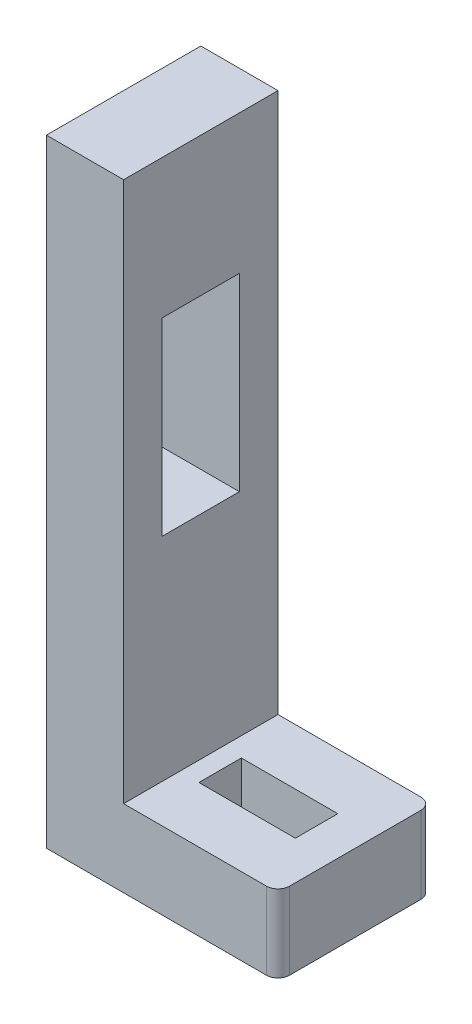
ISO-10303-21;
HEADER;
FILE_DESCRIPTION(('STEP AP214'),'2;1');
FILE_NAME('part.step','',(''),(''),'','','');
FILE_SCHEMA(('AUTOMOTIVE_DESIGN { 1 0 10303 214 1 1 1 1 }'));
ENDSEC;
DATA;
#1=APPLICATION_CONTEXT('core data for automotive mechanical design processes');
#2=APPLICATION_PROTOCOL_DEFINITION('international standard','automotive_design',2000,#1);
#3=PRODUCT_CONTEXT('',#1,'mechanical');
#4=PRODUCT('Part','Part','',(#3));
#5=PRODUCT_RELATED_PRODUCT_CATEGORY('part','',(#4));
#6=PRODUCT_DEFINITION_FORMATION('','',#4);
#7=PRODUCT_DEFINITION_CONTEXT('part definition',#1,'design');
#8=PRODUCT_DEFINITION('design','',#6,#7);
#9=PRODUCT_DEFINITION_SHAPE('','',#8);
#10=(LENGTH_UNIT() NAMED_UNIT(*) SI_UNIT(.MILLI.,.METRE.));
#11=(NAMED_UNIT(*) PLANE_ANGLE_UNIT() SI_UNIT($,.RADIAN.));
#12=(NAMED_UNIT(*) SI_UNIT($,.STERADIAN.) SOLID_ANGLE_UNIT());
#13=UNCERTAINTY_MEASURE_WITH_UNIT(LENGTH_MEASURE(1.E-05),#10,'distance_accuracy_value','');
#14=(GEOMETRIC_REPRESENTATION_CONTEXT(3) GLOBAL_UNCERTAINTY_ASSIGNED_CONTEXT((#13)) GLOBAL_UNIT_ASSIGNED_CONTEXT((#10,
#11,#12)) REPRESENTATION_CONTEXT('',''));
#15=CARTESIAN_POINT('',(0.,0.,0.));
#16=DIRECTION('',(0.,0.,1.));
#17=DIRECTION('',(1.,0.,0.));
#18=AXIS2_PLACEMENT_3D('',#15,#16,#17);
#19=CARTESIAN_POINT('',(60.,0.,40.));
#20=DIRECTION('',(0.,1.,0.));
#21=DIRECTION('',(-1.,0.,0.));
#22=AXIS2_PLACEMENT_3D('',#19,#20,#21);
#23=PLANE('',#22);
#24=DIRECTION('',(-1.,0.,0.));
#25=VECTOR('',#24,1.);
#26=CARTESIAN_POINT('',(25.,0.,14.5));
#27=LINE('',#26,#25);
#28=CARTESIAN_POINT('',(50.,0.,14.5));
#29=VERTEX_POINT('',#28);
#30=CARTESIAN_POINT('',(25.,0.,14.5));
#31=VERTEX_POINT('',#30);
#32=EDGE_CURVE('E193',#29,#31,#27,.T.);
#33=ORIENTED_EDGE('',*,*,#32,.T.);
#34=DIRECTION('',(0.,0.,1.));
#35=VECTOR('',#34,1.);
#36=CARTESIAN_POINT('',(25.,0.,14.5));
#37=LINE('',#36,#35);
#38=CARTESIAN_POINT('',(25.,0.,25.5));
#39=VERTEX_POINT('',#38);
#40=EDGE_CURVE('E183',#31,#39,#37,.T.);
#41=ORIENTED_EDGE('',*,*,#40,.T.);
#42=DIRECTION('',(1.,0.,0.));
#43=VECTOR('',#42,1.);
#44=CARTESIAN_POINT('',(25.,0.,25.5));
#45=LINE('',#44,#43);
#46=CARTESIAN_POINT('',(50.,0.,25.5));
#47=VERTEX_POINT('',#46);
#48=EDGE_CURVE('E186',#39,#47,#45,.T.);
#49=ORIENTED_EDGE('',*,*,#48,.T.);
#50=DIRECTION('',(0.,0.,-1.));
#51=VECTOR('',#50,1.);
#52=CARTESIAN_POINT('',(50.,0.,14.5));
#53=LINE('',#52,#51);
#54=EDGE_CURVE('E190',#47,#29,#53,.T.);
#55=ORIENTED_EDGE('',*,*,#54,.T.);
#56=EDGE_LOOP('',(#33,#41,#49,#55));
#57=FACE_BOUND('',#56,.T.);
#58=DIRECTION('',(1.,0.,0.));
#59=VECTOR('',#58,1.);
#60=CARTESIAN_POINT('',(60.,0.,0.));
#61=LINE('',#60,#59);
#62=CARTESIAN_POINT('',(0.,0.,0.));
#63=VERTEX_POINT('',#62);
#64=CARTESIAN_POINT('',(57.,0.,0.));
#65=VERTEX_POINT('',#64);
#66=EDGE_CURVE('E208',#63,#65,#61,.T.);
#67=ORIENTED_EDGE('',*,*,#66,.T.);
#68=CARTESIAN_POINT('',(57.,0.,3.));
#69=DIRECTION('',(0.,1.,0.));
#70=DIRECTION('',(-1.,0.,0.));
#71=AXIS2_PLACEMENT_3D('',#68,#69,#70);
#72=CIRCLE('',#71,3.);
#73=CARTESIAN_POINT('',(60.,0.,3.));
#74=VERTEX_POINT('',#73);
#75=EDGE_CURVE('E41',#65,#74,#72,.F.);
#76=ORIENTED_EDGE('',*,*,#75,.T.);
#77=DIRECTION('',(0.,0.,-1.));
#78=VECTOR('',#77,1.);
#79=CARTESIAN_POINT('',(60.,0.,40.));
#80=LINE('',#79,#78);
#81=CARTESIAN_POINT('',(60.,0.,37.));
#82=VERTEX_POINT('',#81);
#83=EDGE_CURVE('E251',#82,#74,#80,.T.);
#84=ORIENTED_EDGE('',*,*,#83,.F.);
#85=CARTESIAN_POINT('',(57.,0.,37.));
#86=DIRECTION('',(0.,1.,0.));
#87=DIRECTION('',(-1.,0.,0.));
#88=AXIS2_PLACEMENT_3D('',#85,#86,#87);
#89=CIRCLE('',#88,3.);
#90=CARTESIAN_POINT('',(57.,0.,40.));
#91=VERTEX_POINT('',#90);
#92=EDGE_CURVE('E265',#82,#91,#89,.F.);
#93=ORIENTED_EDGE('',*,*,#92,.T.);
#94=DIRECTION('',(1.,0.,0.));
#95=VECTOR('',#94,1.);
#96=CARTESIAN_POINT('',(60.,0.,40.));
#97=LINE('',#96,#95);
#98=CARTESIAN_POINT('',(0.,0.,40.));
#99=VERTEX_POINT('',#98);
#100=EDGE_CURVE('E215',#99,#91,#97,.T.);
#101=ORIENTED_EDGE('',*,*,#100,.F.);
#102=DIRECTION('',(0.,0.,-1.));
#103=VECTOR('',#102,1.);
#104=CARTESIAN_POINT('',(0.,0.,40.));
#105=LINE('',#104,#103);
#106=EDGE_CURVE('E227',#99,#63,#105,.T.);
#107=ORIENTED_EDGE('',*,*,#106,.T.);
#108=EDGE_LOOP('',(#67,#76,#84,#93,#101,#107));
#109=FACE_BOUND('',#108,.T.);
#110=ADVANCED_FACE('F33',(#57,#109),#23,.F.);
#111=CARTESIAN_POINT('',(60.,20.,40.));
#112=DIRECTION('',(-1.,0.,0.));
#113=DIRECTION('',(0.,0.,1.));
#114=AXIS2_PLACEMENT_3D('',#111,#112,#113);
#115=PLANE('',#114);
#116=ORIENTED_EDGE('',*,*,#83,.T.);
#117=DIRECTION('',(0.,1.,0.));
#118=VECTOR('',#117,1.);
#119=CARTESIAN_POINT('',(60.,20.,3.));
#120=LINE('',#119,#118);
#121=CARTESIAN_POINT('',(60.,20.,3.));
#122=VERTEX_POINT('',#121);
#123=EDGE_CURVE('E256',#74,#122,#120,.T.);
#124=ORIENTED_EDGE('',*,*,#123,.T.);
#125=DIRECTION('',(0.,0.,-1.));
#126=VECTOR('',#125,1.);
#127=CARTESIAN_POINT('',(60.,20.,40.));
#128=LINE('',#127,#126);
#129=CARTESIAN_POINT('',(60.,20.,37.));
#130=VERTEX_POINT('',#129);
#131=EDGE_CURVE('E248',#130,#122,#128,.T.);
#132=ORIENTED_EDGE('',*,*,#131,.F.);
#133=DIRECTION('',(0.,1.,0.));
#134=VECTOR('',#133,1.);
#135=CARTESIAN_POINT('',(60.,20.,37.));
#136=LINE('',#135,#134);
#137=EDGE_CURVE('E254',#130,#82,#136,.F.);
#138=ORIENTED_EDGE('',*,*,#137,.T.);
#139=EDGE_LOOP('',(#116,#124,#132,#138));
#140=FACE_BOUND('',#139,.T.);
#141=ADVANCED_FACE('F275',(#140),#115,.F.);
#142=CARTESIAN_POINT('',(20.,20.,40.));
#143=DIRECTION('',(0.,-1.,0.));
#144=DIRECTION('',(0.,0.,-1.));
#145=AXIS2_PLACEMENT_3D('',#142,#143,#144);
#146=PLANE('',#145);
#147=DIRECTION('',(1.,0.,0.));
#148=VECTOR('',#147,1.);
#149=CARTESIAN_POINT('',(25.,20.,25.5));
#150=LINE('',#149,#148);
#151=CARTESIAN_POINT('',(25.,20.,25.5));
#152=VERTEX_POINT('',#151);
#153=CARTESIAN_POINT('',(50.,20.,25.5));
#154=VERTEX_POINT('',#153);
#155=EDGE_CURVE('E198',#152,#154,#150,.T.);
#156=ORIENTED_EDGE('',*,*,#155,.F.);
#157=DIRECTION('',(0.,0.,1.));
#158=VECTOR('',#157,1.);
#159=CARTESIAN_POINT('',(25.,20.,14.5));
#160=LINE('',#159,#158);
#161=CARTESIAN_POINT('',(25.,20.,14.5));
#162=VERTEX_POINT('',#161);
#163=EDGE_CURVE('E179',#162,#152,#160,.T.);
#164=ORIENTED_EDGE('',*,*,#163,.F.);
#165=DIRECTION('',(-1.,0.,0.));
#166=VECTOR('',#165,1.);
#167=CARTESIAN_POINT('',(25.,20.,14.5));
#168=LINE('',#167,#166);
#169=CARTESIAN_POINT('',(50.,20.,14.5));
#170=VERTEX_POINT('',#169);
#171=EDGE_CURVE('E187',#170,#162,#168,.T.);
#172=ORIENTED_EDGE('',*,*,#171,.F.);
#173=DIRECTION('',(0.,0.,-1.));
#174=VECTOR('',#173,1.);
#175=CARTESIAN_POINT('',(50.,20.,14.5));
#176=LINE('',#175,#174);
#177=EDGE_CURVE('E201',#154,#170,#176,.T.);
#178=ORIENTED_EDGE('',*,*,#177,.F.);
#179=EDGE_LOOP('',(#156,#164,#172,#178));
#180=FACE_BOUND('',#179,.T.);
#181=ORIENTED_EDGE('',*,*,#131,.T.);
#182=CARTESIAN_POINT('',(57.,20.,3.));
#183=DIRECTION('',(0.,-1.,0.));
#184=DIRECTION('',(0.,0.,-1.));
#185=AXIS2_PLACEMENT_3D('',#182,#183,#184);
#186=CIRCLE('',#185,3.);
#187=CARTESIAN_POINT('',(57.,20.,0.));
#188=VERTEX_POINT('',#187);
#189=EDGE_CURVE('E261',#122,#188,#186,.F.);
#190=ORIENTED_EDGE('',*,*,#189,.T.);
#191=DIRECTION('',(-1.,0.,0.));
#192=VECTOR('',#191,1.);
#193=CARTESIAN_POINT('',(20.,20.,0.));
#194=LINE('',#193,#192);
#195=CARTESIAN_POINT('',(20.,20.,0.));
#196=VERTEX_POINT('',#195);
#197=EDGE_CURVE('E230',#188,#196,#194,.T.);
#198=ORIENTED_EDGE('',*,*,#197,.T.);
#199=DIRECTION('',(0.,0.,-1.));
#200=VECTOR('',#199,1.);
#201=CARTESIAN_POINT('',(20.,20.,40.));
#202=LINE('',#201,#200);
#203=CARTESIAN_POINT('',(20.,20.,40.));
#204=VERTEX_POINT('',#203);
#205=EDGE_CURVE('E245',#204,#196,#202,.T.);
#206=ORIENTED_EDGE('',*,*,#205,.F.);
#207=DIRECTION('',(-1.,0.,0.));
#208=VECTOR('',#207,1.);
#209=CARTESIAN_POINT('',(20.,20.,40.));
#210=LINE('',#209,#208);
#211=CARTESIAN_POINT('',(57.,20.,40.));
#212=VERTEX_POINT('',#211);
#213=EDGE_CURVE('E218',#212,#204,#210,.T.);
#214=ORIENTED_EDGE('',*,*,#213,.F.);
#215=CARTESIAN_POINT('',(57.,20.,37.));
#216=DIRECTION('',(0.,-1.,0.));
#217=DIRECTION('',(0.,0.,-1.));
#218=AXIS2_PLACEMENT_3D('',#215,#216,#217);
#219=CIRCLE('',#218,3.);
#220=EDGE_CURVE('E259',#212,#130,#219,.F.);
#221=ORIENTED_EDGE('',*,*,#220,.T.);
#222=EDGE_LOOP('',(#181,#190,#198,#206,#214,#221));
#223=FACE_BOUND('',#222,.T.);
#224=ADVANCED_FACE('F281',(#180,#223),#146,.F.);
#225=CARTESIAN_POINT('',(20.,160.,40.));
#226=DIRECTION('',(-1.,0.,0.));
#227=DIRECTION('',(0.,-1.,0.));
#228=AXIS2_PLACEMENT_3D('',#225,#226,#227);
#229=PLANE('',#228);
#230=DIRECTION('',(0.,0.,-1.));
#231=VECTOR('',#230,1.);
#232=CARTESIAN_POINT('',(20.,75.,30.));
#233=LINE('',#232,#231);
#234=CARTESIAN_POINT('',(20.,75.,30.));
#235=VERTEX_POINT('',#234);
#236=CARTESIAN_POINT('',(20.,75.,10.));
#237=VERTEX_POINT('',#236);
#238=EDGE_CURVE('E173',#235,#237,#233,.T.);
#239=ORIENTED_EDGE('',*,*,#238,.F.);
#240=DIRECTION('',(0.,-1.,0.));
#241=VECTOR('',#240,1.);
#242=CARTESIAN_POINT('',(20.,124.,30.));
#243=LINE('',#242,#241);
#244=CARTESIAN_POINT('',(20.,124.,30.));
#245=VERTEX_POINT('',#244);
#246=EDGE_CURVE('E48',#245,#235,#243,.T.);
#247=ORIENTED_EDGE('',*,*,#246,.F.);
#248=DIRECTION('',(0.,0.,1.));
#249=VECTOR('',#248,1.);
#250=CARTESIAN_POINT('',(20.,124.,30.));
#251=LINE('',#250,#249);
#252=CARTESIAN_POINT('',(20.,124.,10.));
#253=VERTEX_POINT('',#252);
#254=EDGE_CURVE('E164',#253,#245,#251,.T.);
#255=ORIENTED_EDGE('',*,*,#254,.F.);
#256=DIRECTION('',(0.,1.,0.));
#257=VECTOR('',#256,1.);
#258=CARTESIAN_POINT('',(20.,124.,10.));
#259=LINE('',#258,#257);
#260=EDGE_CURVE('E167',#237,#253,#259,.T.);
#261=ORIENTED_EDGE('',*,*,#260,.F.);
#262=EDGE_LOOP('',(#239,#247,#255,#261));
#263=FACE_BOUND('',#262,.T.);
#264=DIRECTION('',(0.,1.,0.));
#265=VECTOR('',#264,1.);
#266=CARTESIAN_POINT('',(20.,160.,0.));
#267=LINE('',#266,#265);
#268=CARTESIAN_POINT('',(20.,160.,0.));
#269=VERTEX_POINT('',#268);
#270=EDGE_CURVE('E232',#196,#269,#267,.T.);
#271=ORIENTED_EDGE('',*,*,#270,.T.);
#272=DIRECTION('',(0.,0.,-1.));
#273=VECTOR('',#272,1.);
#274=CARTESIAN_POINT('',(20.,160.,40.));
#275=LINE('',#274,#273);
#276=CARTESIAN_POINT('',(20.,160.,40.));
#277=VERTEX_POINT('',#276);
#278=EDGE_CURVE('E242',#277,#269,#275,.T.);
#279=ORIENTED_EDGE('',*,*,#278,.F.);
#280=DIRECTION('',(0.,1.,0.));
#281=VECTOR('',#280,1.);
#282=CARTESIAN_POINT('',(20.,160.,40.));
#283=LINE('',#282,#281);
#284=EDGE_CURVE('E221',#204,#277,#283,.T.);
#285=ORIENTED_EDGE('',*,*,#284,.F.);
#286=ORIENTED_EDGE('',*,*,#205,.T.);
#287=EDGE_LOOP('',(#271,#279,#285,#286));
#288=FACE_BOUND('',#287,.T.);
#289=ADVANCED_FACE('F290',(#263,#288),#229,.F.);
#290=CARTESIAN_POINT('',(0.,160.,40.));
#291=DIRECTION('',(0.,-1.,0.));
#292=DIRECTION('',(0.,0.,-1.));
#293=AXIS2_PLACEMENT_3D('',#290,#291,#292);
#294=PLANE('',#293);
#295=DIRECTION('',(-1.,0.,0.));
#296=VECTOR('',#295,1.);
#297=CARTESIAN_POINT('',(0.,160.,0.));
#298=LINE('',#297,#296);
#299=CARTESIAN_POINT('',(0.,160.,0.));
#300=VERTEX_POINT('',#299);
#301=EDGE_CURVE('E234',#269,#300,#298,.T.);
#302=ORIENTED_EDGE('',*,*,#301,.T.);
#303=DIRECTION('',(0.,0.,-1.));
#304=VECTOR('',#303,1.);
#305=CARTESIAN_POINT('',(0.,160.,40.));
#306=LINE('',#305,#304);
#307=CARTESIAN_POINT('',(0.,160.,40.));
#308=VERTEX_POINT('',#307);
#309=EDGE_CURVE('E239',#308,#300,#306,.T.);
#310=ORIENTED_EDGE('',*,*,#309,.F.);
#311=DIRECTION('',(-1.,0.,0.));
#312=VECTOR('',#311,1.);
#313=CARTESIAN_POINT('',(0.,160.,40.));
#314=LINE('',#313,#312);
#315=EDGE_CURVE('E223',#277,#308,#314,.T.);
#316=ORIENTED_EDGE('',*,*,#315,.F.);
#317=ORIENTED_EDGE('',*,*,#278,.T.);
#318=EDGE_LOOP('',(#302,#310,#316,#317));
#319=FACE_BOUND('',#318,.T.);
#320=ADVANCED_FACE('F294',(#319),#294,.F.);
#321=CARTESIAN_POINT('',(0.,0.,40.));
#322=DIRECTION('',(1.,0.,0.));
#323=DIRECTION('',(0.,0.,-1.));
#324=AXIS2_PLACEMENT_3D('',#321,#322,#323);
#325=PLANE('',#324);
#326=DIRECTION('',(0.,0.,1.));
#327=VECTOR('',#326,1.);
#328=CARTESIAN_POINT('',(0.,124.,30.));
#329=LINE('',#328,#327);
#330=CARTESIAN_POINT('',(0.,124.,10.));
#331=VERTEX_POINT('',#330);
#332=CARTESIAN_POINT('',(0.,124.,30.));
#333=VERTEX_POINT('',#332);
#334=EDGE_CURVE('E154',#331,#333,#329,.T.);
#335=ORIENTED_EDGE('',*,*,#334,.T.);
#336=DIRECTION('',(0.,-1.,0.));
#337=VECTOR('',#336,1.);
#338=CARTESIAN_POINT('',(0.,124.,30.));
#339=LINE('',#338,#337);
#340=CARTESIAN_POINT('',(0.,75.,30.));
#341=VERTEX_POINT('',#340);
#342=EDGE_CURVE('E148',#333,#341,#339,.T.);
#343=ORIENTED_EDGE('',*,*,#342,.T.);
#344=DIRECTION('',(0.,0.,-1.));
#345=VECTOR('',#344,1.);
#346=CARTESIAN_POINT('',(0.,75.,30.));
#347=LINE('',#346,#345);
#348=CARTESIAN_POINT('',(0.,75.,10.));
#349=VERTEX_POINT('',#348);
#350=EDGE_CURVE('E157',#341,#349,#347,.T.);
#351=ORIENTED_EDGE('',*,*,#350,.T.);
#352=DIRECTION('',(0.,1.,0.));
#353=VECTOR('',#352,1.);
#354=CARTESIAN_POINT('',(0.,124.,10.));
#355=LINE('',#354,#353);
#356=EDGE_CURVE('E56',#349,#331,#355,.T.);
#357=ORIENTED_EDGE('',*,*,#356,.T.);
#358=EDGE_LOOP('',(#335,#343,#351,#357));
#359=FACE_BOUND('',#358,.T.);
#360=DIRECTION('',(0.,-1.,0.));
#361=VECTOR('',#360,1.);
#362=CARTESIAN_POINT('',(0.,0.,0.));
#363=LINE('',#362,#361);
#364=EDGE_CURVE('E219',#300,#63,#363,.T.);
#365=ORIENTED_EDGE('',*,*,#364,.T.);
#366=ORIENTED_EDGE('',*,*,#106,.F.);
#367=DIRECTION('',(0.,-1.,0.));
#368=VECTOR('',#367,1.);
#369=CARTESIAN_POINT('',(0.,0.,40.));
#370=LINE('',#369,#368);
#371=EDGE_CURVE('E225',#308,#99,#370,.T.);
#372=ORIENTED_EDGE('',*,*,#371,.F.);
#373=ORIENTED_EDGE('',*,*,#309,.T.);
#374=EDGE_LOOP('',(#365,#366,#372,#373));
#375=FACE_BOUND('',#374,.T.);
#376=ADVANCED_FACE('F161',(#359,#375),#325,.F.);
#377=CARTESIAN_POINT('',(0.,0.,40.));
#378=DIRECTION('',(0.,0.,-1.));
#379=DIRECTION('',(-1.,0.,0.));
#380=AXIS2_PLACEMENT_3D('',#377,#378,#379);
#381=PLANE('',#380);
#382=ORIENTED_EDGE('',*,*,#100,.T.);
#383=DIRECTION('',(0.,1.,0.));
#384=VECTOR('',#383,1.);
#385=CARTESIAN_POINT('',(57.,0.,40.));
#386=LINE('',#385,#384);
#387=EDGE_CURVE('E11',#91,#212,#386,.T.);
#388=ORIENTED_EDGE('',*,*,#387,.T.);
#389=ORIENTED_EDGE('',*,*,#213,.T.);
#390=ORIENTED_EDGE('',*,*,#284,.T.);
#391=ORIENTED_EDGE('',*,*,#315,.T.);
#392=ORIENTED_EDGE('',*,*,#371,.T.);
#393=EDGE_LOOP('',(#382,#388,#389,#390,#391,#392));
#394=FACE_BOUND('',#393,.T.);
#395=ADVANCED_FACE('F298',(#394),#381,.F.);
#396=CARTESIAN_POINT('',(0.,0.,0.));
#397=DIRECTION('',(0.,0.,-1.));
#398=DIRECTION('',(-1.,0.,0.));
#399=AXIS2_PLACEMENT_3D('',#396,#397,#398);
#400=PLANE('',#399);
#401=ORIENTED_EDGE('',*,*,#197,.F.);
#402=DIRECTION('',(0.,1.,0.));
#403=VECTOR('',#402,1.);
#404=CARTESIAN_POINT('',(57.,0.,0.));
#405=LINE('',#404,#403);
#406=EDGE_CURVE('E263',#188,#65,#405,.F.);
#407=ORIENTED_EDGE('',*,*,#406,.T.);
#408=ORIENTED_EDGE('',*,*,#66,.F.);
#409=ORIENTED_EDGE('',*,*,#364,.F.);
#410=ORIENTED_EDGE('',*,*,#301,.F.);
#411=ORIENTED_EDGE('',*,*,#270,.F.);
#412=EDGE_LOOP('',(#401,#407,#408,#409,#410,#411));
#413=FACE_BOUND('',#412,.T.);
#414=ADVANCED_FACE('F285',(#413),#400,.T.);
#415=CARTESIAN_POINT('',(57.,20.,3.));
#416=DIRECTION('',(0.,-1.,0.));
#417=DIRECTION('',(0.,0.,-1.));
#418=AXIS2_PLACEMENT_3D('',#415,#416,#417);
#419=CYLINDRICAL_SURFACE('',#418,3.);
#420=ORIENTED_EDGE('',*,*,#75,.F.);
#421=ORIENTED_EDGE('',*,*,#406,.F.);
#422=ORIENTED_EDGE('',*,*,#189,.F.);
#423=ORIENTED_EDGE('',*,*,#123,.F.);
#424=EDGE_LOOP('',(#420,#421,#422,#423));
#425=FACE_BOUND('',#424,.T.);
#426=ADVANCED_FACE('F278',(#425),#419,.T.);
#427=CARTESIAN_POINT('',(57.,0.,37.));
#428=DIRECTION('',(0.,1.,0.));
#429=DIRECTION('',(0.,0.,1.));
#430=AXIS2_PLACEMENT_3D('',#427,#428,#429);
#431=CYLINDRICAL_SURFACE('',#430,3.);
#432=ORIENTED_EDGE('',*,*,#92,.F.);
#433=ORIENTED_EDGE('',*,*,#137,.F.);
#434=ORIENTED_EDGE('',*,*,#220,.F.);
#435=ORIENTED_EDGE('',*,*,#387,.F.);
#436=EDGE_LOOP('',(#432,#433,#434,#435));
#437=FACE_BOUND('',#436,.T.);
#438=ADVANCED_FACE('F35',(#437),#431,.T.);
#439=CARTESIAN_POINT('',(25.,0.,14.5));
#440=DIRECTION('',(-1.,0.,0.));
#441=DIRECTION('',(0.,0.,1.));
#442=AXIS2_PLACEMENT_3D('',#439,#440,#441);
#443=PLANE('',#442);
#444=ORIENTED_EDGE('',*,*,#163,.T.);
#445=DIRECTION('',(0.,1.,0.));
#446=VECTOR('',#445,1.);
#447=CARTESIAN_POINT('',(25.,0.,25.5));
#448=LINE('',#447,#446);
#449=EDGE_CURVE('E196',#39,#152,#448,.T.);
#450=ORIENTED_EDGE('',*,*,#449,.F.);
#451=ORIENTED_EDGE('',*,*,#40,.F.);
#452=DIRECTION('',(0.,1.,0.));
#453=VECTOR('',#452,1.);
#454=CARTESIAN_POINT('',(25.,0.,14.5));
#455=LINE('',#454,#453);
#456=EDGE_CURVE('E206',#31,#162,#455,.T.);
#457=ORIENTED_EDGE('',*,*,#456,.T.);
#458=EDGE_LOOP('',(#444,#450,#451,#457));
#459=FACE_BOUND('',#458,.T.);
#460=ADVANCED_FACE('F326',(#459),#443,.F.);
#461=CARTESIAN_POINT('',(25.,0.,14.5));
#462=DIRECTION('',(0.,0.,-1.));
#463=DIRECTION('',(-1.,0.,0.));
#464=AXIS2_PLACEMENT_3D('',#461,#462,#463);
#465=PLANE('',#464);
#466=ORIENTED_EDGE('',*,*,#171,.T.);
#467=ORIENTED_EDGE('',*,*,#456,.F.);
#468=ORIENTED_EDGE('',*,*,#32,.F.);
#469=DIRECTION('',(0.,1.,0.));
#470=VECTOR('',#469,1.);
#471=CARTESIAN_POINT('',(50.,0.,14.5));
#472=LINE('',#471,#470);
#473=EDGE_CURVE('E209',#29,#170,#472,.T.);
#474=ORIENTED_EDGE('',*,*,#473,.T.);
#475=EDGE_LOOP('',(#466,#467,#468,#474));
#476=FACE_BOUND('',#475,.T.);
#477=ADVANCED_FACE('F332',(#476),#465,.F.);
#478=CARTESIAN_POINT('',(50.,0.,14.5));
#479=DIRECTION('',(1.,0.,0.));
#480=DIRECTION('',(0.,0.,-1.));
#481=AXIS2_PLACEMENT_3D('',#478,#479,#480);
#482=PLANE('',#481);
#483=ORIENTED_EDGE('',*,*,#177,.T.);
#484=ORIENTED_EDGE('',*,*,#473,.F.);
#485=ORIENTED_EDGE('',*,*,#54,.F.);
#486=DIRECTION('',(0.,1.,0.));
#487=VECTOR('',#486,1.);
#488=CARTESIAN_POINT('',(50.,0.,25.5));
#489=LINE('',#488,#487);
#490=EDGE_CURVE('E211',#47,#154,#489,.T.);
#491=ORIENTED_EDGE('',*,*,#490,.T.);
#492=EDGE_LOOP('',(#483,#484,#485,#491));
#493=FACE_BOUND('',#492,.T.);
#494=ADVANCED_FACE('F337',(#493),#482,.F.);
#495=CARTESIAN_POINT('',(25.,0.,25.5));
#496=DIRECTION('',(0.,0.,1.));
#497=DIRECTION('',(1.,0.,0.));
#498=AXIS2_PLACEMENT_3D('',#495,#496,#497);
#499=PLANE('',#498);
#500=ORIENTED_EDGE('',*,*,#155,.T.);
#501=ORIENTED_EDGE('',*,*,#490,.F.);
#502=ORIENTED_EDGE('',*,*,#48,.F.);
#503=ORIENTED_EDGE('',*,*,#449,.T.);
#504=EDGE_LOOP('',(#500,#501,#502,#503));
#505=FACE_BOUND('',#504,.T.);
#506=ADVANCED_FACE('F334',(#505),#499,.F.);
#507=CARTESIAN_POINT('',(0.,124.,30.));
#508=DIRECTION('',(0.,0.,1.));
#509=DIRECTION('',(0.,-1.,0.));
#510=AXIS2_PLACEMENT_3D('',#507,#508,#509);
#511=PLANE('',#510);
#512=ORIENTED_EDGE('',*,*,#246,.T.);
#513=DIRECTION('',(1.,0.,0.));
#514=VECTOR('',#513,1.);
#515=CARTESIAN_POINT('',(0.,75.,30.));
#516=LINE('',#515,#514);
#517=EDGE_CURVE('E144',#341,#235,#516,.T.);
#518=ORIENTED_EDGE('',*,*,#517,.F.);
#519=ORIENTED_EDGE('',*,*,#342,.F.);
#520=DIRECTION('',(1.,0.,0.));
#521=VECTOR('',#520,1.);
#522=CARTESIAN_POINT('',(0.,124.,30.));
#523=LINE('',#522,#521);
#524=EDGE_CURVE('E177',#333,#245,#523,.T.);
#525=ORIENTED_EDGE('',*,*,#524,.T.);
#526=EDGE_LOOP('',(#512,#518,#519,#525));
#527=FACE_BOUND('',#526,.T.);
#528=ADVANCED_FACE('F146',(#527),#511,.F.);
#529=CARTESIAN_POINT('',(0.,124.,30.));
#530=DIRECTION('',(0.,1.,0.));
#531=DIRECTION('',(-1.,0.,0.));
#532=AXIS2_PLACEMENT_3D('',#529,#530,#531);
#533=PLANE('',#532);
#534=ORIENTED_EDGE('',*,*,#254,.T.);
#535=ORIENTED_EDGE('',*,*,#524,.F.);
#536=ORIENTED_EDGE('',*,*,#334,.F.);
#537=DIRECTION('',(1.,0.,0.));
#538=VECTOR('',#537,1.);
#539=CARTESIAN_POINT('',(0.,124.,10.));
#540=LINE('',#539,#538);
#541=EDGE_CURVE('E180',#331,#253,#540,.T.);
#542=ORIENTED_EDGE('',*,*,#541,.T.);
#543=EDGE_LOOP('',(#534,#535,#536,#542));
#544=FACE_BOUND('',#543,.T.);
#545=ADVANCED_FACE('F347',(#544),#533,.F.);
#546=CARTESIAN_POINT('',(0.,124.,10.));
#547=DIRECTION('',(0.,0.,-1.));
#548=DIRECTION('',(0.,1.,0.));
#549=AXIS2_PLACEMENT_3D('',#546,#547,#548);
#550=PLANE('',#549);
#551=ORIENTED_EDGE('',*,*,#260,.T.);
#552=ORIENTED_EDGE('',*,*,#541,.F.);
#553=ORIENTED_EDGE('',*,*,#356,.F.);
#554=DIRECTION('',(1.,0.,0.));
#555=VECTOR('',#554,1.);
#556=CARTESIAN_POINT('',(0.,75.,10.));
#557=LINE('',#556,#555);
#558=EDGE_CURVE('E153',#349,#237,#557,.T.);
#559=ORIENTED_EDGE('',*,*,#558,.T.);
#560=EDGE_LOOP('',(#551,#552,#553,#559));
#561=FACE_BOUND('',#560,.T.);
#562=ADVANCED_FACE('F350',(#561),#550,.F.);
#563=CARTESIAN_POINT('',(0.,75.,30.));
#564=DIRECTION('',(0.,-1.,0.));
#565=DIRECTION('',(1.,0.,0.));
#566=AXIS2_PLACEMENT_3D('',#563,#564,#565);
#567=PLANE('',#566);
#568=ORIENTED_EDGE('',*,*,#238,.T.);
#569=ORIENTED_EDGE('',*,*,#558,.F.);
#570=ORIENTED_EDGE('',*,*,#350,.F.);
#571=ORIENTED_EDGE('',*,*,#517,.T.);
#572=EDGE_LOOP('',(#568,#569,#570,#571));
#573=FACE_BOUND('',#572,.T.);
#574=ADVANCED_FACE('F158',(#573),#567,.F.);
#575=CLOSED_SHELL('',(#110,#141,#224,#289,#320,#376,#395,#414,#426,#438,#460,#477,#494,#506,
#528,#545,#562,#574));
#576=MANIFOLD_SOLID_BREP('B2',#575);
#577=ADVANCED_BREP_SHAPE_REPRESENTATION('',(#18,#576),#14);
#578=SHAPE_DEFINITION_REPRESENTATION(#9,#577);
ENDSEC;
END-ISO-10303-21;
